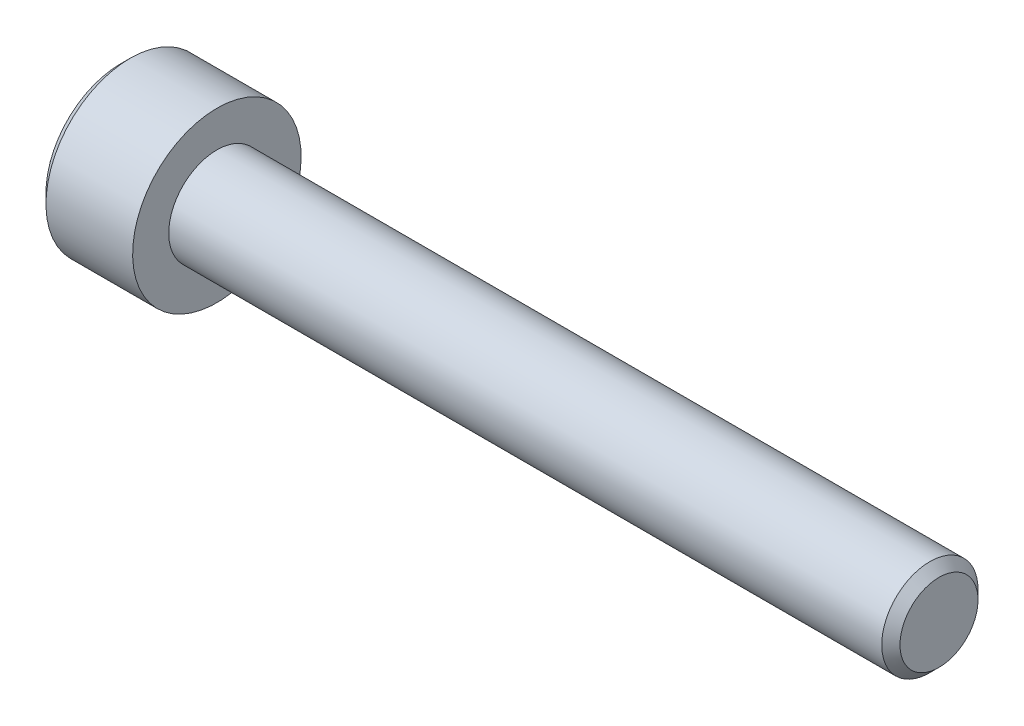
ISO-10303-21;
HEADER;
FILE_DESCRIPTION(('STEP AP214'),'2;1');
FILE_NAME('part.step','',(''),(''),'','','');
FILE_SCHEMA(('AUTOMOTIVE_DESIGN { 1 0 10303 214 1 1 1 1 }'));
ENDSEC;
DATA;
#1=APPLICATION_CONTEXT('core data for automotive mechanical design processes');
#2=APPLICATION_PROTOCOL_DEFINITION('international standard','automotive_design',2000,#1);
#3=PRODUCT_CONTEXT('',#1,'mechanical');
#4=PRODUCT('Part','Part','',(#3));
#5=PRODUCT_RELATED_PRODUCT_CATEGORY('part','',(#4));
#6=PRODUCT_DEFINITION_FORMATION('','',#4);
#7=PRODUCT_DEFINITION_CONTEXT('part definition',#1,'design');
#8=PRODUCT_DEFINITION('design','',#6,#7);
#9=PRODUCT_DEFINITION_SHAPE('','',#8);
#10=(LENGTH_UNIT() NAMED_UNIT(*) SI_UNIT(.MILLI.,.METRE.));
#11=(NAMED_UNIT(*) PLANE_ANGLE_UNIT() SI_UNIT($,.RADIAN.));
#12=(NAMED_UNIT(*) SI_UNIT($,.STERADIAN.) SOLID_ANGLE_UNIT());
#13=UNCERTAINTY_MEASURE_WITH_UNIT(LENGTH_MEASURE(1.E-05),#10,'distance_accuracy_value','');
#14=(GEOMETRIC_REPRESENTATION_CONTEXT(3) GLOBAL_UNCERTAINTY_ASSIGNED_CONTEXT((#13)) GLOBAL_UNIT_ASSIGNED_CONTEXT((#10,
#11,#12)) REPRESENTATION_CONTEXT('',''));
#15=CARTESIAN_POINT('',(0.,0.,0.));
#16=DIRECTION('',(0.,0.,1.));
#17=DIRECTION('',(1.,0.,0.));
#18=AXIS2_PLACEMENT_3D('',#15,#16,#17);
#19=CARTESIAN_POINT('',(30.,0.,0.));
#20=DIRECTION('',(1.,0.,0.));
#21=DIRECTION('',(0.,1.,0.));
#22=AXIS2_PLACEMENT_3D('',#19,#20,#21);
#23=CYLINDRICAL_SURFACE('',#22,2.);
#24=CARTESIAN_POINT('',(0.,0.,0.));
#25=DIRECTION('',(1.,0.,0.));
#26=DIRECTION('',(0.,1.,0.));
#27=AXIS2_PLACEMENT_3D('',#24,#25,#26);
#28=CIRCLE('',#27,2.);
#29=CARTESIAN_POINT('',(0.,2.,0.));
#30=VERTEX_POINT('',#29);
#31=EDGE_CURVE('E141',#30,#30,#28,.T.);
#32=ORIENTED_EDGE('',*,*,#31,.T.);
#33=EDGE_LOOP('',(#32));
#34=FACE_BOUND('',#33,.T.);
#35=CARTESIAN_POINT('',(29.621,0.,0.));
#36=DIRECTION('',(1.,0.,0.));
#37=DIRECTION('',(0.,1.,0.));
#38=AXIS2_PLACEMENT_3D('',#35,#36,#37);
#39=CIRCLE('',#38,2.);
#40=CARTESIAN_POINT('',(29.621,2.,0.));
#41=VERTEX_POINT('',#40);
#42=EDGE_CURVE('E11',#41,#41,#39,.T.);
#43=ORIENTED_EDGE('',*,*,#42,.F.);
#44=EDGE_LOOP('',(#43));
#45=FACE_BOUND('',#44,.T.);
#46=ADVANCED_FACE('F45',(#34,#45),#23,.T.);
#47=CARTESIAN_POINT('',(30.,0.,0.));
#48=DIRECTION('',(-1.,0.,0.));
#49=DIRECTION('',(0.,-1.,0.));
#50=AXIS2_PLACEMENT_3D('',#47,#48,#49);
#51=CONICAL_SURFACE('',#50,1.621,0.785398163397452);
#52=ORIENTED_EDGE('',*,*,#42,.T.);
#53=EDGE_LOOP('',(#52));
#54=FACE_BOUND('',#53,.T.);
#55=CARTESIAN_POINT('',(30.,0.,0.));
#56=DIRECTION('',(1.,0.,0.));
#57=DIRECTION('',(0.,1.,0.));
#58=AXIS2_PLACEMENT_3D('',#55,#56,#57);
#59=CIRCLE('',#58,1.621);
#60=CARTESIAN_POINT('',(30.,1.621,0.));
#61=VERTEX_POINT('',#60);
#62=EDGE_CURVE('E47',#61,#61,#59,.T.);
#63=ORIENTED_EDGE('',*,*,#62,.F.);
#64=EDGE_LOOP('',(#63));
#65=FACE_BOUND('',#64,.T.);
#66=ADVANCED_FACE('F165',(#54,#65),#51,.T.);
#67=CARTESIAN_POINT('',(30.,1.621,0.));
#68=DIRECTION('',(1.,0.,0.));
#69=DIRECTION('',(0.,1.,0.));
#70=AXIS2_PLACEMENT_3D('',#67,#68,#69);
#71=PLANE('',#70);
#72=ORIENTED_EDGE('',*,*,#62,.T.);
#73=EDGE_LOOP('',(#72));
#74=FACE_BOUND('',#73,.T.);
#75=ADVANCED_FACE('F162',(#74),#71,.T.);
#76=CARTESIAN_POINT('',(-4.,0.,0.));
#77=DIRECTION('',(-1.,0.,0.));
#78=DIRECTION('',(0.,-1.,0.));
#79=AXIS2_PLACEMENT_3D('',#76,#77,#78);
#80=PLANE('',#79);
#81=DIRECTION('',(0.,0.5,-0.866025403784439));
#82=VECTOR('',#81,1.);
#83=CARTESIAN_POINT('',(-4.,0.866025403784438,1.5));
#84=LINE('',#83,#82);
#85=CARTESIAN_POINT('',(-4.,0.866025403784438,1.5));
#86=VERTEX_POINT('',#85);
#87=CARTESIAN_POINT('',(-4.,1.73205080756888,0.));
#88=VERTEX_POINT('',#87);
#89=EDGE_CURVE('E57',#86,#88,#84,.T.);
#90=ORIENTED_EDGE('',*,*,#89,.F.);
#91=DIRECTION('',(0.,1.,0.));
#92=VECTOR('',#91,1.);
#93=CARTESIAN_POINT('',(-4.,-0.866025403784439,1.5));
#94=LINE('',#93,#92);
#95=CARTESIAN_POINT('',(-4.,-0.866025403784439,1.5));
#96=VERTEX_POINT('',#95);
#97=EDGE_CURVE('E136',#96,#86,#94,.T.);
#98=ORIENTED_EDGE('',*,*,#97,.F.);
#99=DIRECTION('',(0.,0.5,0.866025403784439));
#100=VECTOR('',#99,1.);
#101=CARTESIAN_POINT('',(-4.,-1.73205080756888,0.));
#102=LINE('',#101,#100);
#103=CARTESIAN_POINT('',(-4.,-1.73205080756888,0.));
#104=VERTEX_POINT('',#103);
#105=EDGE_CURVE('E140',#104,#96,#102,.T.);
#106=ORIENTED_EDGE('',*,*,#105,.F.);
#107=DIRECTION('',(0.,-0.5,0.866025403784439));
#108=VECTOR('',#107,1.);
#109=CARTESIAN_POINT('',(-4.,-0.866025403784439,-1.5));
#110=LINE('',#109,#108);
#111=CARTESIAN_POINT('',(-4.,-0.866025403784439,-1.5));
#112=VERTEX_POINT('',#111);
#113=EDGE_CURVE('E104',#112,#104,#110,.T.);
#114=ORIENTED_EDGE('',*,*,#113,.F.);
#115=DIRECTION('',(0.,-1.,0.));
#116=VECTOR('',#115,1.);
#117=CARTESIAN_POINT('',(-4.,0.866025403784438,-1.5));
#118=LINE('',#117,#116);
#119=CARTESIAN_POINT('',(-4.,0.866025403784438,-1.5));
#120=VERTEX_POINT('',#119);
#121=EDGE_CURVE('E131',#120,#112,#118,.T.);
#122=ORIENTED_EDGE('',*,*,#121,.F.);
#123=DIRECTION('',(0.,-0.5,-0.866025403784439));
#124=VECTOR('',#123,1.);
#125=CARTESIAN_POINT('',(-4.,1.73205080756888,0.));
#126=LINE('',#125,#124);
#127=EDGE_CURVE('E128',#88,#120,#126,.T.);
#128=ORIENTED_EDGE('',*,*,#127,.F.);
#129=EDGE_LOOP('',(#90,#98,#106,#114,#122,#128));
#130=FACE_BOUND('',#129,.T.);
#131=CARTESIAN_POINT('',(-4.,0.,0.));
#132=DIRECTION('',(1.,0.,0.));
#133=DIRECTION('',(0.,1.,0.));
#134=AXIS2_PLACEMENT_3D('',#131,#132,#133);
#135=CIRCLE('',#134,3.1);
#136=CARTESIAN_POINT('',(-4.,3.1,0.));
#137=VERTEX_POINT('',#136);
#138=EDGE_CURVE('E160',#137,#137,#135,.T.);
#139=ORIENTED_EDGE('',*,*,#138,.F.);
#140=EDGE_LOOP('',(#139));
#141=FACE_BOUND('',#140,.T.);
#142=ADVANCED_FACE('F171',(#130,#141),#80,.T.);
#143=CARTESIAN_POINT('',(-3.6,0.,0.));
#144=DIRECTION('',(1.,0.,0.));
#145=DIRECTION('',(0.,1.,0.));
#146=AXIS2_PLACEMENT_3D('',#143,#144,#145);
#147=CONICAL_SURFACE('',#146,3.5,0.785398163397443);
#148=ORIENTED_EDGE('',*,*,#138,.T.);
#149=EDGE_LOOP('',(#148));
#150=FACE_BOUND('',#149,.T.);
#151=CARTESIAN_POINT('',(-3.6,0.,0.));
#152=DIRECTION('',(1.,0.,0.));
#153=DIRECTION('',(0.,1.,0.));
#154=AXIS2_PLACEMENT_3D('',#151,#152,#153);
#155=CIRCLE('',#154,3.5);
#156=CARTESIAN_POINT('',(-3.6,3.5,0.));
#157=VERTEX_POINT('',#156);
#158=EDGE_CURVE('E152',#157,#157,#155,.T.);
#159=ORIENTED_EDGE('',*,*,#158,.F.);
#160=EDGE_LOOP('',(#159));
#161=FACE_BOUND('',#160,.T.);
#162=ADVANCED_FACE('F178',(#150,#161),#147,.T.);
#163=CARTESIAN_POINT('',(30.,0.,0.));
#164=DIRECTION('',(1.,0.,0.));
#165=DIRECTION('',(0.,1.,0.));
#166=AXIS2_PLACEMENT_3D('',#163,#164,#165);
#167=CYLINDRICAL_SURFACE('',#166,3.5);
#168=ORIENTED_EDGE('',*,*,#158,.T.);
#169=EDGE_LOOP('',(#168));
#170=FACE_BOUND('',#169,.T.);
#171=CARTESIAN_POINT('',(0.,0.,0.));
#172=DIRECTION('',(1.,0.,0.));
#173=DIRECTION('',(0.,1.,0.));
#174=AXIS2_PLACEMENT_3D('',#171,#172,#173);
#175=CIRCLE('',#174,3.5);
#176=CARTESIAN_POINT('',(0.,3.5,0.));
#177=VERTEX_POINT('',#176);
#178=EDGE_CURVE('E153',#177,#177,#175,.T.);
#179=ORIENTED_EDGE('',*,*,#178,.F.);
#180=EDGE_LOOP('',(#179));
#181=FACE_BOUND('',#180,.T.);
#182=ADVANCED_FACE('F185',(#170,#181),#167,.T.);
#183=CARTESIAN_POINT('',(0.,2.,0.));
#184=DIRECTION('',(1.,0.,0.));
#185=DIRECTION('',(0.,1.,0.));
#186=AXIS2_PLACEMENT_3D('',#183,#184,#185);
#187=PLANE('',#186);
#188=ORIENTED_EDGE('',*,*,#178,.T.);
#189=EDGE_LOOP('',(#188));
#190=FACE_BOUND('',#189,.T.);
#191=ORIENTED_EDGE('',*,*,#31,.F.);
#192=EDGE_LOOP('',(#191));
#193=FACE_BOUND('',#192,.T.);
#194=ADVANCED_FACE('F187',(#190,#193),#187,.T.);
#195=CARTESIAN_POINT('',(-2.,0.866025403784439,1.5));
#196=DIRECTION('',(0.,0.866025403784439,0.5));
#197=DIRECTION('',(0.,-0.5,0.866025403784439));
#198=AXIS2_PLACEMENT_3D('',#195,#196,#197);
#199=PLANE('',#198);
#200=ORIENTED_EDGE('',*,*,#89,.T.);
#201=DIRECTION('',(-1.,0.,0.));
#202=VECTOR('',#201,1.);
#203=CARTESIAN_POINT('',(-2.,1.73205080756888,0.));
#204=LINE('',#203,#202);
#205=CARTESIAN_POINT('',(-2.,1.73205080756888,0.));
#206=VERTEX_POINT('',#205);
#207=EDGE_CURVE('E88',#206,#88,#204,.T.);
#208=ORIENTED_EDGE('',*,*,#207,.F.);
#209=DIRECTION('',(0.,0.5,-0.866025403784439));
#210=VECTOR('',#209,1.);
#211=CARTESIAN_POINT('',(-2.,0.866025403784439,1.5));
#212=LINE('',#211,#210);
#213=CARTESIAN_POINT('',(-2.,0.866025403784439,1.5));
#214=VERTEX_POINT('',#213);
#215=EDGE_CURVE('E142',#214,#206,#212,.T.);
#216=ORIENTED_EDGE('',*,*,#215,.F.);
#217=DIRECTION('',(-1.,0.,0.));
#218=VECTOR('',#217,1.);
#219=CARTESIAN_POINT('',(-2.,0.866025403784439,1.5));
#220=LINE('',#219,#218);
#221=EDGE_CURVE('E61',#214,#86,#220,.T.);
#222=ORIENTED_EDGE('',*,*,#221,.T.);
#223=EDGE_LOOP('',(#200,#208,#216,#222));
#224=FACE_BOUND('',#223,.T.);
#225=ADVANCED_FACE('F188',(#224),#199,.F.);
#226=CARTESIAN_POINT('',(-2.,-0.866025403784439,1.5));
#227=DIRECTION('',(0.,0.,1.));
#228=DIRECTION('',(0.,-1.,0.));
#229=AXIS2_PLACEMENT_3D('',#226,#227,#228);
#230=PLANE('',#229);
#231=ORIENTED_EDGE('',*,*,#97,.T.);
#232=ORIENTED_EDGE('',*,*,#221,.F.);
#233=DIRECTION('',(0.,1.,0.));
#234=VECTOR('',#233,1.);
#235=CARTESIAN_POINT('',(-2.,-0.866025403784439,1.5));
#236=LINE('',#235,#234);
#237=CARTESIAN_POINT('',(-2.,-0.866025403784439,1.5));
#238=VERTEX_POINT('',#237);
#239=EDGE_CURVE('E116',#238,#214,#236,.T.);
#240=ORIENTED_EDGE('',*,*,#239,.F.);
#241=DIRECTION('',(-1.,0.,0.));
#242=VECTOR('',#241,1.);
#243=CARTESIAN_POINT('',(-2.,-0.866025403784439,1.5));
#244=LINE('',#243,#242);
#245=EDGE_CURVE('E108',#238,#96,#244,.T.);
#246=ORIENTED_EDGE('',*,*,#245,.T.);
#247=EDGE_LOOP('',(#231,#232,#240,#246));
#248=FACE_BOUND('',#247,.T.);
#249=ADVANCED_FACE('F191',(#248),#230,.F.);
#250=CARTESIAN_POINT('',(-2.,-1.73205080756888,0.));
#251=DIRECTION('',(0.,-0.866025403784439,0.5));
#252=DIRECTION('',(0.,-0.5,-0.866025403784439));
#253=AXIS2_PLACEMENT_3D('',#250,#251,#252);
#254=PLANE('',#253);
#255=ORIENTED_EDGE('',*,*,#105,.T.);
#256=ORIENTED_EDGE('',*,*,#245,.F.);
#257=DIRECTION('',(0.,0.5,0.866025403784439));
#258=VECTOR('',#257,1.);
#259=CARTESIAN_POINT('',(-2.,-1.73205080756888,0.));
#260=LINE('',#259,#258);
#261=CARTESIAN_POINT('',(-2.,-1.73205080756888,0.));
#262=VERTEX_POINT('',#261);
#263=EDGE_CURVE('E115',#262,#238,#260,.T.);
#264=ORIENTED_EDGE('',*,*,#263,.F.);
#265=DIRECTION('',(-1.,0.,0.));
#266=VECTOR('',#265,1.);
#267=CARTESIAN_POINT('',(-2.,-1.73205080756888,0.));
#268=LINE('',#267,#266);
#269=EDGE_CURVE('E97',#262,#104,#268,.T.);
#270=ORIENTED_EDGE('',*,*,#269,.T.);
#271=EDGE_LOOP('',(#255,#256,#264,#270));
#272=FACE_BOUND('',#271,.T.);
#273=ADVANCED_FACE('F113',(#272),#254,.F.);
#274=CARTESIAN_POINT('',(-2.,-0.866025403784439,-1.5));
#275=DIRECTION('',(0.,-0.866025403784439,-0.5));
#276=DIRECTION('',(0.,0.5,-0.866025403784439));
#277=AXIS2_PLACEMENT_3D('',#274,#275,#276);
#278=PLANE('',#277);
#279=ORIENTED_EDGE('',*,*,#113,.T.);
#280=ORIENTED_EDGE('',*,*,#269,.F.);
#281=DIRECTION('',(0.,-0.5,0.866025403784439));
#282=VECTOR('',#281,1.);
#283=CARTESIAN_POINT('',(-2.,-0.866025403784439,-1.5));
#284=LINE('',#283,#282);
#285=CARTESIAN_POINT('',(-2.,-0.866025403784439,-1.5));
#286=VERTEX_POINT('',#285);
#287=EDGE_CURVE('E103',#286,#262,#284,.T.);
#288=ORIENTED_EDGE('',*,*,#287,.F.);
#289=DIRECTION('',(-1.,0.,0.));
#290=VECTOR('',#289,1.);
#291=CARTESIAN_POINT('',(-2.,-0.866025403784439,-1.5));
#292=LINE('',#291,#290);
#293=EDGE_CURVE('E107',#286,#112,#292,.T.);
#294=ORIENTED_EDGE('',*,*,#293,.T.);
#295=EDGE_LOOP('',(#279,#280,#288,#294));
#296=FACE_BOUND('',#295,.T.);
#297=ADVANCED_FACE('F100',(#296),#278,.F.);
#298=CARTESIAN_POINT('',(-2.,0.866025403784439,-1.5));
#299=DIRECTION('',(0.,0.,-1.));
#300=DIRECTION('',(-1.,0.,0.));
#301=AXIS2_PLACEMENT_3D('',#298,#299,#300);
#302=PLANE('',#301);
#303=ORIENTED_EDGE('',*,*,#121,.T.);
#304=ORIENTED_EDGE('',*,*,#293,.F.);
#305=DIRECTION('',(0.,-1.,0.));
#306=VECTOR('',#305,1.);
#307=CARTESIAN_POINT('',(-2.,0.866025403784439,-1.5));
#308=LINE('',#307,#306);
#309=CARTESIAN_POINT('',(-2.,0.866025403784439,-1.5));
#310=VERTEX_POINT('',#309);
#311=EDGE_CURVE('E125',#310,#286,#308,.T.);
#312=ORIENTED_EDGE('',*,*,#311,.F.);
#313=DIRECTION('',(-1.,0.,0.));
#314=VECTOR('',#313,1.);
#315=CARTESIAN_POINT('',(-2.,0.866025403784439,-1.5));
#316=LINE('',#315,#314);
#317=EDGE_CURVE('E147',#310,#120,#316,.T.);
#318=ORIENTED_EDGE('',*,*,#317,.T.);
#319=EDGE_LOOP('',(#303,#304,#312,#318));
#320=FACE_BOUND('',#319,.T.);
#321=ADVANCED_FACE('F196',(#320),#302,.F.);
#322=CARTESIAN_POINT('',(-2.,1.73205080756888,0.));
#323=DIRECTION('',(0.,0.866025403784439,-0.5));
#324=DIRECTION('',(0.,0.5,0.866025403784439));
#325=AXIS2_PLACEMENT_3D('',#322,#323,#324);
#326=PLANE('',#325);
#327=ORIENTED_EDGE('',*,*,#127,.T.);
#328=ORIENTED_EDGE('',*,*,#317,.F.);
#329=DIRECTION('',(0.,-0.5,-0.866025403784439));
#330=VECTOR('',#329,1.);
#331=CARTESIAN_POINT('',(-2.,1.73205080756888,0.));
#332=LINE('',#331,#330);
#333=EDGE_CURVE('E121',#206,#310,#332,.T.);
#334=ORIENTED_EDGE('',*,*,#333,.F.);
#335=ORIENTED_EDGE('',*,*,#207,.T.);
#336=EDGE_LOOP('',(#327,#328,#334,#335));
#337=FACE_BOUND('',#336,.T.);
#338=ADVANCED_FACE('F193',(#337),#326,.F.);
#339=CARTESIAN_POINT('',(-2.,0.,0.));
#340=DIRECTION('',(-1.,0.,0.));
#341=DIRECTION('',(0.,0.,1.));
#342=AXIS2_PLACEMENT_3D('',#339,#340,#341);
#343=PLANE('',#342);
#344=ORIENTED_EDGE('',*,*,#215,.T.);
#345=ORIENTED_EDGE('',*,*,#333,.T.);
#346=ORIENTED_EDGE('',*,*,#311,.T.);
#347=ORIENTED_EDGE('',*,*,#287,.T.);
#348=ORIENTED_EDGE('',*,*,#263,.T.);
#349=ORIENTED_EDGE('',*,*,#239,.T.);
#350=EDGE_LOOP('',(#344,#345,#346,#347,#348,#349));
#351=FACE_BOUND('',#350,.T.);
#352=ADVANCED_FACE('F118',(#351),#343,.T.);
#353=CLOSED_SHELL('',(#46,#66,#75,#142,#162,#182,#194,#225,#249,#273,#297,#321,#338,#352));
#354=MANIFOLD_SOLID_BREP('B2',#353);
#355=ADVANCED_BREP_SHAPE_REPRESENTATION('',(#18,#354),#14);
#356=SHAPE_DEFINITION_REPRESENTATION(#9,#355);
ENDSEC;
END-ISO-10303-21;
